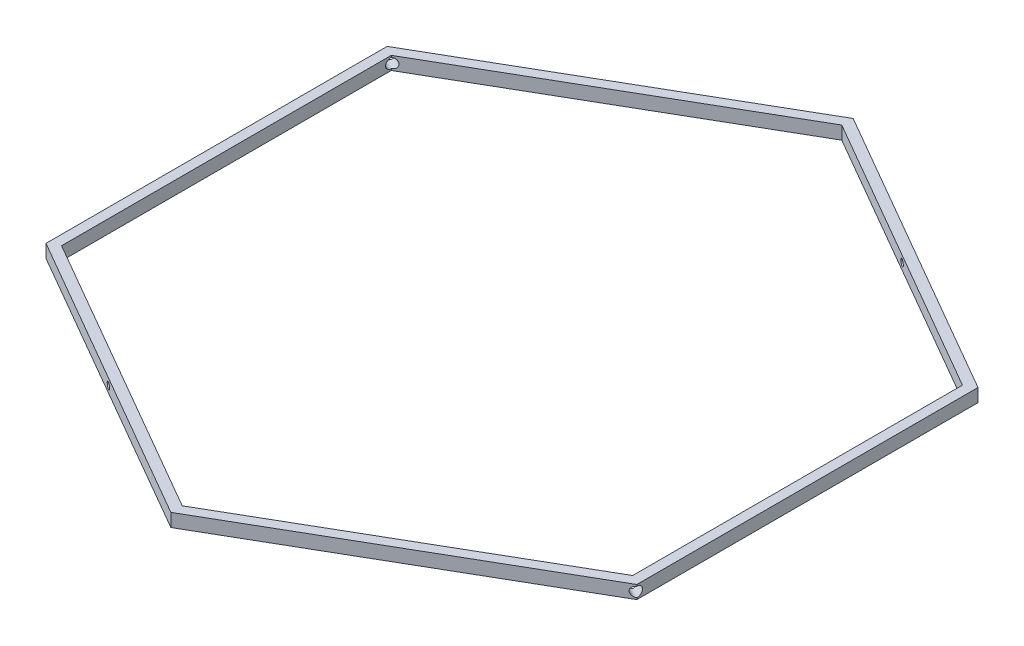
ISO-10303-21;
HEADER;
FILE_DESCRIPTION(('STEP AP214'),'2;1');
FILE_NAME('part.step','',(''),(''),'','','');
FILE_SCHEMA(('AUTOMOTIVE_DESIGN { 1 0 10303 214 1 1 1 1 }'));
ENDSEC;
DATA;
#1=APPLICATION_CONTEXT('core data for automotive mechanical design processes');
#2=APPLICATION_PROTOCOL_DEFINITION('international standard','automotive_design',2000,#1);
#3=PRODUCT_CONTEXT('',#1,'mechanical');
#4=PRODUCT('Part','Part','',(#3));
#5=PRODUCT_RELATED_PRODUCT_CATEGORY('part','',(#4));
#6=PRODUCT_DEFINITION_FORMATION('','',#4);
#7=PRODUCT_DEFINITION_CONTEXT('part definition',#1,'design');
#8=PRODUCT_DEFINITION('design','',#6,#7);
#9=PRODUCT_DEFINITION_SHAPE('','',#8);
#10=(LENGTH_UNIT() NAMED_UNIT(*) SI_UNIT(.MILLI.,.METRE.));
#11=(NAMED_UNIT(*) PLANE_ANGLE_UNIT() SI_UNIT($,.RADIAN.));
#12=(NAMED_UNIT(*) SI_UNIT($,.STERADIAN.) SOLID_ANGLE_UNIT());
#13=UNCERTAINTY_MEASURE_WITH_UNIT(LENGTH_MEASURE(1.E-05),#10,'distance_accuracy_value','');
#14=(GEOMETRIC_REPRESENTATION_CONTEXT(3) GLOBAL_UNCERTAINTY_ASSIGNED_CONTEXT((#13)) GLOBAL_UNIT_ASSIGNED_CONTEXT((#10,
#11,#12)) REPRESENTATION_CONTEXT('',''));
#15=CARTESIAN_POINT('',(0.,0.,0.));
#16=DIRECTION('',(0.,0.,1.));
#17=DIRECTION('',(1.,0.,0.));
#18=AXIS2_PLACEMENT_3D('',#15,#16,#17);
#19=CARTESIAN_POINT('',(0.,4.,0.));
#20=DIRECTION('',(0.,1.,0.));
#21=DIRECTION('',(0.,0.,1.));
#22=AXIS2_PLACEMENT_3D('',#19,#20,#21);
#23=PLANE('',#22);
#24=DIRECTION('',(-0.866025403784439,0.,-0.5));
#25=VECTOR('',#24,1.);
#26=CARTESIAN_POINT('',(90.,4.,-51.9615242270663));
#27=LINE('',#26,#25);
#28=CARTESIAN_POINT('',(90.,4.,-51.9615242270663));
#29=VERTEX_POINT('',#28);
#30=CARTESIAN_POINT('',(0.,4.,-103.923048454133));
#31=VERTEX_POINT('',#30);
#32=EDGE_CURVE('E200',#29,#31,#27,.T.);
#33=ORIENTED_EDGE('',*,*,#32,.T.);
#34=DIRECTION('',(-0.866025403784438,0.,0.5));
#35=VECTOR('',#34,1.);
#36=CARTESIAN_POINT('',(0.,4.,-103.923048454133));
#37=LINE('',#36,#35);
#38=CARTESIAN_POINT('',(-90.,4.,-51.9615242270663));
#39=VERTEX_POINT('',#38);
#40=EDGE_CURVE('E204',#31,#39,#37,.T.);
#41=ORIENTED_EDGE('',*,*,#40,.T.);
#42=DIRECTION('',(0.,0.,1.));
#43=VECTOR('',#42,1.);
#44=CARTESIAN_POINT('',(-90.,4.,-51.9615242270663));
#45=LINE('',#44,#43);
#46=CARTESIAN_POINT('',(-90.,4.,51.9615242270663));
#47=VERTEX_POINT('',#46);
#48=EDGE_CURVE('E208',#39,#47,#45,.T.);
#49=ORIENTED_EDGE('',*,*,#48,.T.);
#50=DIRECTION('',(0.866025403784439,0.,0.5));
#51=VECTOR('',#50,1.);
#52=CARTESIAN_POINT('',(-90.,4.,51.9615242270663));
#53=LINE('',#52,#51);
#54=CARTESIAN_POINT('',(0.,4.,103.923048454133));
#55=VERTEX_POINT('',#54);
#56=EDGE_CURVE('E211',#47,#55,#53,.T.);
#57=ORIENTED_EDGE('',*,*,#56,.T.);
#58=DIRECTION('',(0.866025403784438,0.,-0.5));
#59=VECTOR('',#58,1.);
#60=CARTESIAN_POINT('',(0.,4.,103.923048454133));
#61=LINE('',#60,#59);
#62=CARTESIAN_POINT('',(90.,4.,51.9615242270663));
#63=VERTEX_POINT('',#62);
#64=EDGE_CURVE('E214',#55,#63,#61,.T.);
#65=ORIENTED_EDGE('',*,*,#64,.T.);
#66=DIRECTION('',(0.,0.,-1.));
#67=VECTOR('',#66,1.);
#68=CARTESIAN_POINT('',(90.,4.,51.9615242270663));
#69=LINE('',#68,#67);
#70=EDGE_CURVE('E217',#63,#29,#69,.T.);
#71=ORIENTED_EDGE('',*,*,#70,.T.);
#72=EDGE_LOOP('',(#33,#41,#49,#57,#65,#71));
#73=FACE_BOUND('',#72,.T.);
#74=DIRECTION('',(-0.866025403784439,0.,-0.5));
#75=VECTOR('',#74,1.);
#76=CARTESIAN_POINT('',(87.,4.,-50.2294734194974));
#77=LINE('',#76,#75);
#78=CARTESIAN_POINT('',(87.,4.,-50.2294734194974));
#79=VERTEX_POINT('',#78);
#80=CARTESIAN_POINT('',(0.,4.,-100.458946838995));
#81=VERTEX_POINT('',#80);
#82=EDGE_CURVE('E291',#79,#81,#77,.T.);
#83=ORIENTED_EDGE('',*,*,#82,.F.);
#84=DIRECTION('',(0.,0.,-1.));
#85=VECTOR('',#84,1.);
#86=CARTESIAN_POINT('',(87.,4.,50.2294734194974));
#87=LINE('',#86,#85);
#88=CARTESIAN_POINT('',(87.,4.,50.2294734194974));
#89=VERTEX_POINT('',#88);
#90=EDGE_CURVE('E288',#89,#79,#87,.T.);
#91=ORIENTED_EDGE('',*,*,#90,.F.);
#92=DIRECTION('',(0.866025403784439,0.,-0.5));
#93=VECTOR('',#92,1.);
#94=CARTESIAN_POINT('',(0.,4.,100.458946838995));
#95=LINE('',#94,#93);
#96=CARTESIAN_POINT('',(0.,4.,100.458946838995));
#97=VERTEX_POINT('',#96);
#98=EDGE_CURVE('E173',#97,#89,#95,.T.);
#99=ORIENTED_EDGE('',*,*,#98,.F.);
#100=DIRECTION('',(0.866025403784439,0.,0.5));
#101=VECTOR('',#100,1.);
#102=CARTESIAN_POINT('',(-87.,4.,50.2294734194975));
#103=LINE('',#102,#101);
#104=CARTESIAN_POINT('',(-87.,4.,50.2294734194975));
#105=VERTEX_POINT('',#104);
#106=EDGE_CURVE('E300',#105,#97,#103,.T.);
#107=ORIENTED_EDGE('',*,*,#106,.F.);
#108=DIRECTION('',(0.,0.,1.));
#109=VECTOR('',#108,1.);
#110=CARTESIAN_POINT('',(-87.,4.,-50.2294734194974));
#111=LINE('',#110,#109);
#112=CARTESIAN_POINT('',(-87.,4.,-50.2294734194974));
#113=VERTEX_POINT('',#112);
#114=EDGE_CURVE('E297',#113,#105,#111,.T.);
#115=ORIENTED_EDGE('',*,*,#114,.F.);
#116=DIRECTION('',(-0.866025403784439,0.,0.5));
#117=VECTOR('',#116,1.);
#118=CARTESIAN_POINT('',(0.,4.,-100.458946838995));
#119=LINE('',#118,#117);
#120=EDGE_CURVE('E294',#81,#113,#119,.T.);
#121=ORIENTED_EDGE('',*,*,#120,.F.);
#122=EDGE_LOOP('',(#83,#91,#99,#107,#115,#121));
#123=FACE_BOUND('',#122,.T.);
#124=ADVANCED_FACE('F43',(#73,#123),#23,.T.);
#125=CARTESIAN_POINT('',(0.,0.,0.));
#126=DIRECTION('',(0.,1.,0.));
#127=DIRECTION('',(0.,0.,1.));
#128=AXIS2_PLACEMENT_3D('',#125,#126,#127);
#129=PLANE('',#128);
#130=DIRECTION('',(-0.866025403784439,0.,-0.5));
#131=VECTOR('',#130,1.);
#132=CARTESIAN_POINT('',(90.,0.,-51.9615242270663));
#133=LINE('',#132,#131);
#134=CARTESIAN_POINT('',(90.,0.,-51.9615242270663));
#135=VERTEX_POINT('',#134);
#136=CARTESIAN_POINT('',(0.,0.,-103.923048454133));
#137=VERTEX_POINT('',#136);
#138=EDGE_CURVE('E199',#135,#137,#133,.T.);
#139=ORIENTED_EDGE('',*,*,#138,.F.);
#140=DIRECTION('',(0.,0.,-1.));
#141=VECTOR('',#140,1.);
#142=CARTESIAN_POINT('',(90.,0.,51.9615242270663));
#143=LINE('',#142,#141);
#144=CARTESIAN_POINT('',(90.,0.,51.9615242270663));
#145=VERTEX_POINT('',#144);
#146=EDGE_CURVE('E205',#145,#135,#143,.T.);
#147=ORIENTED_EDGE('',*,*,#146,.F.);
#148=DIRECTION('',(0.866025403784438,0.,-0.5));
#149=VECTOR('',#148,1.);
#150=CARTESIAN_POINT('',(0.,0.,103.923048454133));
#151=LINE('',#150,#149);
#152=CARTESIAN_POINT('',(0.,0.,103.923048454133));
#153=VERTEX_POINT('',#152);
#154=EDGE_CURVE('E234',#153,#145,#151,.T.);
#155=ORIENTED_EDGE('',*,*,#154,.F.);
#156=DIRECTION('',(0.866025403784439,0.,0.5));
#157=VECTOR('',#156,1.);
#158=CARTESIAN_POINT('',(-90.,0.,51.9615242270663));
#159=LINE('',#158,#157);
#160=CARTESIAN_POINT('',(-90.,0.,51.9615242270663));
#161=VERTEX_POINT('',#160);
#162=EDGE_CURVE('E231',#161,#153,#159,.T.);
#163=ORIENTED_EDGE('',*,*,#162,.F.);
#164=DIRECTION('',(0.,0.,1.));
#165=VECTOR('',#164,1.);
#166=CARTESIAN_POINT('',(-90.,0.,-51.9615242270663));
#167=LINE('',#166,#165);
#168=CARTESIAN_POINT('',(-90.,0.,-51.9615242270663));
#169=VERTEX_POINT('',#168);
#170=EDGE_CURVE('E228',#169,#161,#167,.T.);
#171=ORIENTED_EDGE('',*,*,#170,.F.);
#172=DIRECTION('',(-0.866025403784438,0.,0.5));
#173=VECTOR('',#172,1.);
#174=CARTESIAN_POINT('',(0.,0.,-103.923048454133));
#175=LINE('',#174,#173);
#176=EDGE_CURVE('E224',#137,#169,#175,.T.);
#177=ORIENTED_EDGE('',*,*,#176,.F.);
#178=EDGE_LOOP('',(#139,#147,#155,#163,#171,#177));
#179=FACE_BOUND('',#178,.T.);
#180=DIRECTION('',(0.,0.,-1.));
#181=VECTOR('',#180,1.);
#182=CARTESIAN_POINT('',(87.,0.,50.2294734194974));
#183=LINE('',#182,#181);
#184=CARTESIAN_POINT('',(87.,0.,50.2294734194974));
#185=VERTEX_POINT('',#184);
#186=CARTESIAN_POINT('',(87.,0.,-50.2294734194974));
#187=VERTEX_POINT('',#186);
#188=EDGE_CURVE('E287',#185,#187,#183,.T.);
#189=ORIENTED_EDGE('',*,*,#188,.T.);
#190=DIRECTION('',(-0.866025403784439,0.,-0.5));
#191=VECTOR('',#190,1.);
#192=CARTESIAN_POINT('',(87.,0.,-50.2294734194974));
#193=LINE('',#192,#191);
#194=CARTESIAN_POINT('',(0.,0.,-100.458946838995));
#195=VERTEX_POINT('',#194);
#196=EDGE_CURVE('E309',#187,#195,#193,.T.);
#197=ORIENTED_EDGE('',*,*,#196,.T.);
#198=DIRECTION('',(-0.866025403784439,0.,0.5));
#199=VECTOR('',#198,1.);
#200=CARTESIAN_POINT('',(0.,0.,-100.458946838995));
#201=LINE('',#200,#199);
#202=CARTESIAN_POINT('',(-87.,0.,-50.2294734194974));
#203=VERTEX_POINT('',#202);
#204=EDGE_CURVE('E313',#195,#203,#201,.T.);
#205=ORIENTED_EDGE('',*,*,#204,.T.);
#206=DIRECTION('',(0.,0.,1.));
#207=VECTOR('',#206,1.);
#208=CARTESIAN_POINT('',(-87.,0.,-50.2294734194974));
#209=LINE('',#208,#207);
#210=CARTESIAN_POINT('',(-87.,0.,50.2294734194975));
#211=VERTEX_POINT('',#210);
#212=EDGE_CURVE('E317',#203,#211,#209,.T.);
#213=ORIENTED_EDGE('',*,*,#212,.T.);
#214=DIRECTION('',(0.866025403784439,0.,0.5));
#215=VECTOR('',#214,1.);
#216=CARTESIAN_POINT('',(-87.,0.,50.2294734194975));
#217=LINE('',#216,#215);
#218=CARTESIAN_POINT('',(0.,0.,100.458946838995));
#219=VERTEX_POINT('',#218);
#220=EDGE_CURVE('E320',#211,#219,#217,.T.);
#221=ORIENTED_EDGE('',*,*,#220,.T.);
#222=DIRECTION('',(0.866025403784439,0.,-0.5));
#223=VECTOR('',#222,1.);
#224=CARTESIAN_POINT('',(0.,0.,100.458946838995));
#225=LINE('',#224,#223);
#226=EDGE_CURVE('E182',#219,#185,#225,.T.);
#227=ORIENTED_EDGE('',*,*,#226,.T.);
#228=EDGE_LOOP('',(#189,#197,#205,#213,#221,#227));
#229=FACE_BOUND('',#228,.T.);
#230=ADVANCED_FACE('F328',(#179,#229),#129,.F.);
#231=CARTESIAN_POINT('',(90.,4.,-51.9615242270663));
#232=DIRECTION('',(-0.5,0.,0.866025403784438));
#233=DIRECTION('',(0.866025403784439,0.,0.5));
#234=AXIS2_PLACEMENT_3D('',#231,#232,#233);
#235=PLANE('',#234);
#236=CARTESIAN_POINT('',(45.,2.,-77.9422863405995));
#237=DIRECTION('',(-0.5,0.,0.866025403784438));
#238=DIRECTION('',(0.866025403784439,0.,0.5));
#239=AXIS2_PLACEMENT_3D('',#236,#237,#238);
#240=CIRCLE('',#239,0.999999999999999);
#241=CARTESIAN_POINT('',(45.8660254037845,2.,-77.4422863405995));
#242=VERTEX_POINT('',#241);
#243=EDGE_CURVE('E273',#242,#242,#240,.T.);
#244=ORIENTED_EDGE('',*,*,#243,.T.);
#245=EDGE_LOOP('',(#244));
#246=FACE_BOUND('',#245,.T.);
#247=ORIENTED_EDGE('',*,*,#138,.T.);
#248=DIRECTION('',(0.,-1.,0.));
#249=VECTOR('',#248,1.);
#250=CARTESIAN_POINT('',(0.,4.,-103.923048454133));
#251=LINE('',#250,#249);
#252=EDGE_CURVE('E52',#31,#137,#251,.T.);
#253=ORIENTED_EDGE('',*,*,#252,.F.);
#254=ORIENTED_EDGE('',*,*,#32,.F.);
#255=DIRECTION('',(0.,-1.,0.));
#256=VECTOR('',#255,1.);
#257=CARTESIAN_POINT('',(90.,4.,-51.9615242270663));
#258=LINE('',#257,#256);
#259=EDGE_CURVE('E220',#29,#135,#258,.T.);
#260=ORIENTED_EDGE('',*,*,#259,.T.);
#261=EDGE_LOOP('',(#247,#253,#254,#260));
#262=FACE_BOUND('',#261,.T.);
#263=ADVANCED_FACE('F45',(#246,#262),#235,.F.);
#264=CARTESIAN_POINT('',(0.,4.,-103.923048454133));
#265=DIRECTION('',(0.5,0.,0.866025403784438));
#266=DIRECTION('',(0.866025403784439,0.,-0.5));
#267=AXIS2_PLACEMENT_3D('',#264,#265,#266);
#268=PLANE('',#267);
#269=DIRECTION('',(0.,-1.,0.));
#270=VECTOR('',#269,1.);
#271=CARTESIAN_POINT('',(-90.,4.,-51.9615242270663));
#272=LINE('',#271,#270);
#273=CARTESIAN_POINT('',(-90.,0.500000000000002,-51.9615242270663));
#274=VERTEX_POINT('',#273);
#275=EDGE_CURVE('E256',#274,#169,#272,.T.);
#276=ORIENTED_EDGE('',*,*,#275,.F.);
#277=CARTESIAN_POINT('',(-90.,2.,-51.9615242270663));
#278=DIRECTION('',(0.5,0.,0.866025403784438));
#279=DIRECTION('',(-0.866025403784439,0.,0.5));
#280=AXIS2_PLACEMENT_3D('',#277,#278,#279);
#281=ELLIPSE('',#280,1.73205080756887,1.5);
#282=CARTESIAN_POINT('',(-90.,3.5,-51.9615242270663));
#283=VERTEX_POINT('',#282);
#284=EDGE_CURVE('E58',#274,#283,#281,.T.);
#285=ORIENTED_EDGE('',*,*,#284,.T.);
#286=EDGE_CURVE('E257',#39,#283,#272,.T.);
#287=ORIENTED_EDGE('',*,*,#286,.F.);
#288=ORIENTED_EDGE('',*,*,#40,.F.);
#289=ORIENTED_EDGE('',*,*,#252,.T.);
#290=ORIENTED_EDGE('',*,*,#176,.T.);
#291=EDGE_LOOP('',(#276,#285,#287,#288,#289,#290));
#292=FACE_BOUND('',#291,.T.);
#293=ADVANCED_FACE('F367',(#292),#268,.F.);
#294=CARTESIAN_POINT('',(-90.,4.,-51.9615242270663));
#295=DIRECTION('',(1.,0.,0.));
#296=DIRECTION('',(0.,0.,-1.));
#297=AXIS2_PLACEMENT_3D('',#294,#295,#296);
#298=PLANE('',#297);
#299=ORIENTED_EDGE('',*,*,#286,.T.);
#300=CARTESIAN_POINT('',(-90.,2.,-51.9615242270663));
#301=DIRECTION('',(1.,0.,0.));
#302=DIRECTION('',(0.,0.,-1.));
#303=AXIS2_PLACEMENT_3D('',#300,#301,#302);
#304=ELLIPSE('',#303,1.73205080756887,1.5);
#305=EDGE_CURVE('E280',#283,#274,#304,.T.);
#306=ORIENTED_EDGE('',*,*,#305,.T.);
#307=ORIENTED_EDGE('',*,*,#275,.T.);
#308=ORIENTED_EDGE('',*,*,#170,.T.);
#309=DIRECTION('',(0.,-1.,0.));
#310=VECTOR('',#309,1.);
#311=CARTESIAN_POINT('',(-90.,4.,51.9615242270663));
#312=LINE('',#311,#310);
#313=EDGE_CURVE('E252',#47,#161,#312,.T.);
#314=ORIENTED_EDGE('',*,*,#313,.F.);
#315=ORIENTED_EDGE('',*,*,#48,.F.);
#316=EDGE_LOOP('',(#299,#306,#307,#308,#314,#315));
#317=FACE_BOUND('',#316,.T.);
#318=ADVANCED_FACE('F363',(#317),#298,.F.);
#319=CARTESIAN_POINT('',(-90.,4.,51.9615242270663));
#320=DIRECTION('',(0.5,0.,-0.866025403784439));
#321=DIRECTION('',(-0.866025403784439,0.,-0.5));
#322=AXIS2_PLACEMENT_3D('',#319,#320,#321);
#323=PLANE('',#322);
#324=CARTESIAN_POINT('',(-45.,2.,77.9422863405996));
#325=DIRECTION('',(-0.5,0.,0.866025403784439));
#326=DIRECTION('',(0.866025403784439,0.,0.5));
#327=AXIS2_PLACEMENT_3D('',#324,#325,#326);
#328=CIRCLE('',#327,0.999999999999999);
#329=CARTESIAN_POINT('',(-44.1339745962156,2.,78.4422863405996));
#330=VERTEX_POINT('',#329);
#331=EDGE_CURVE('E267',#330,#330,#328,.T.);
#332=ORIENTED_EDGE('',*,*,#331,.F.);
#333=EDGE_LOOP('',(#332));
#334=FACE_BOUND('',#333,.T.);
#335=ORIENTED_EDGE('',*,*,#162,.T.);
#336=DIRECTION('',(0.,-1.,0.));
#337=VECTOR('',#336,1.);
#338=CARTESIAN_POINT('',(0.,4.,103.923048454133));
#339=LINE('',#338,#337);
#340=EDGE_CURVE('E248',#55,#153,#339,.T.);
#341=ORIENTED_EDGE('',*,*,#340,.F.);
#342=ORIENTED_EDGE('',*,*,#56,.F.);
#343=ORIENTED_EDGE('',*,*,#313,.T.);
#344=EDGE_LOOP('',(#335,#341,#342,#343));
#345=FACE_BOUND('',#344,.T.);
#346=ADVANCED_FACE('F402',(#334,#345),#323,.F.);
#347=CARTESIAN_POINT('',(0.,4.,103.923048454133));
#348=DIRECTION('',(-0.5,0.,-0.866025403784438));
#349=DIRECTION('',(-0.866025403784439,0.,0.5));
#350=AXIS2_PLACEMENT_3D('',#347,#348,#349);
#351=PLANE('',#350);
#352=DIRECTION('',(0.,-1.,0.));
#353=VECTOR('',#352,1.);
#354=CARTESIAN_POINT('',(90.,4.,51.9615242270663));
#355=LINE('',#354,#353);
#356=CARTESIAN_POINT('',(90.,0.500000000000002,51.9615242270663));
#357=VERTEX_POINT('',#356);
#358=EDGE_CURVE('E243',#357,#145,#355,.T.);
#359=ORIENTED_EDGE('',*,*,#358,.F.);
#360=CARTESIAN_POINT('',(90.,2.,51.9615242270663));
#361=DIRECTION('',(-0.5,0.,-0.866025403784438));
#362=DIRECTION('',(-0.866025403784439,0.,0.5));
#363=AXIS2_PLACEMENT_3D('',#360,#361,#362);
#364=ELLIPSE('',#363,1.73205080756887,1.5);
#365=CARTESIAN_POINT('',(90.,3.5,51.9615242270663));
#366=VERTEX_POINT('',#365);
#367=EDGE_CURVE('E65',#357,#366,#364,.T.);
#368=ORIENTED_EDGE('',*,*,#367,.T.);
#369=EDGE_CURVE('E244',#63,#366,#355,.T.);
#370=ORIENTED_EDGE('',*,*,#369,.F.);
#371=ORIENTED_EDGE('',*,*,#64,.F.);
#372=ORIENTED_EDGE('',*,*,#340,.T.);
#373=ORIENTED_EDGE('',*,*,#154,.T.);
#374=EDGE_LOOP('',(#359,#368,#370,#371,#372,#373));
#375=FACE_BOUND('',#374,.T.);
#376=ADVANCED_FACE('F398',(#375),#351,.F.);
#377=CARTESIAN_POINT('',(90.,4.,51.9615242270663));
#378=DIRECTION('',(-1.,0.,0.));
#379=DIRECTION('',(0.,0.,1.));
#380=AXIS2_PLACEMENT_3D('',#377,#378,#379);
#381=PLANE('',#380);
#382=ORIENTED_EDGE('',*,*,#369,.T.);
#383=CARTESIAN_POINT('',(90.,2.,51.9615242270663));
#384=DIRECTION('',(-1.,0.,0.));
#385=DIRECTION('',(0.,0.,-1.));
#386=AXIS2_PLACEMENT_3D('',#383,#384,#385);
#387=ELLIPSE('',#386,1.73205080756888,1.5);
#388=EDGE_CURVE('E354',#366,#357,#387,.T.);
#389=ORIENTED_EDGE('',*,*,#388,.T.);
#390=ORIENTED_EDGE('',*,*,#358,.T.);
#391=ORIENTED_EDGE('',*,*,#146,.T.);
#392=ORIENTED_EDGE('',*,*,#259,.F.);
#393=ORIENTED_EDGE('',*,*,#70,.F.);
#394=EDGE_LOOP('',(#382,#389,#390,#391,#392,#393));
#395=FACE_BOUND('',#394,.T.);
#396=ADVANCED_FACE('F395',(#395),#381,.F.);
#397=CARTESIAN_POINT('',(87.,4.,50.2294734194974));
#398=DIRECTION('',(-1.,0.,0.));
#399=DIRECTION('',(0.,0.,1.));
#400=AXIS2_PLACEMENT_3D('',#397,#398,#399);
#401=PLANE('',#400);
#402=CARTESIAN_POINT('',(87.,2.,50.2294734194975));
#403=DIRECTION('',(-1.,0.,0.));
#404=DIRECTION('',(0.,0.,-1.));
#405=AXIS2_PLACEMENT_3D('',#402,#403,#404);
#406=ELLIPSE('',#405,1.73205080756887,1.5);
#407=CARTESIAN_POINT('',(87.,3.5,50.2294734194974));
#408=VERTEX_POINT('',#407);
#409=CARTESIAN_POINT('',(87.,0.500000000000002,50.2294734194974));
#410=VERTEX_POINT('',#409);
#411=EDGE_CURVE('E157',#408,#410,#406,.T.);
#412=ORIENTED_EDGE('',*,*,#411,.F.);
#413=DIRECTION('',(0.,-1.,0.));
#414=VECTOR('',#413,1.);
#415=CARTESIAN_POINT('',(87.,4.,50.2294734194974));
#416=LINE('',#415,#414);
#417=EDGE_CURVE('E164',#89,#408,#416,.T.);
#418=ORIENTED_EDGE('',*,*,#417,.F.);
#419=ORIENTED_EDGE('',*,*,#90,.T.);
#420=DIRECTION('',(0.,-1.,0.));
#421=VECTOR('',#420,1.);
#422=CARTESIAN_POINT('',(87.,4.,-50.2294734194974));
#423=LINE('',#422,#421);
#424=EDGE_CURVE('E195',#79,#187,#423,.T.);
#425=ORIENTED_EDGE('',*,*,#424,.T.);
#426=ORIENTED_EDGE('',*,*,#188,.F.);
#427=EDGE_CURVE('E167',#410,#185,#416,.T.);
#428=ORIENTED_EDGE('',*,*,#427,.F.);
#429=EDGE_LOOP('',(#412,#418,#419,#425,#426,#428));
#430=FACE_BOUND('',#429,.T.);
#431=ADVANCED_FACE('F163',(#430),#401,.T.);
#432=CARTESIAN_POINT('',(87.,4.,-50.2294734194974));
#433=DIRECTION('',(-0.5,0.,0.866025403784439));
#434=DIRECTION('',(0.866025403784439,0.,0.5));
#435=AXIS2_PLACEMENT_3D('',#432,#433,#434);
#436=PLANE('',#435);
#437=CARTESIAN_POINT('',(43.5,2.,-75.3442101292462));
#438=DIRECTION('',(-0.5,0.,0.866025403784439));
#439=DIRECTION('',(0.866025403784439,0.,0.5));
#440=AXIS2_PLACEMENT_3D('',#437,#438,#439);
#441=CIRCLE('',#440,0.999999999999999);
#442=CARTESIAN_POINT('',(44.3660254037845,2.,-74.8442101292462));
#443=VERTEX_POINT('',#442);
#444=EDGE_CURVE('E266',#443,#443,#441,.T.);
#445=ORIENTED_EDGE('',*,*,#444,.F.);
#446=EDGE_LOOP('',(#445));
#447=FACE_BOUND('',#446,.T.);
#448=ORIENTED_EDGE('',*,*,#196,.F.);
#449=ORIENTED_EDGE('',*,*,#424,.F.);
#450=ORIENTED_EDGE('',*,*,#82,.T.);
#451=DIRECTION('',(0.,-1.,0.));
#452=VECTOR('',#451,1.);
#453=CARTESIAN_POINT('',(0.,4.,-100.458946838995));
#454=LINE('',#453,#452);
#455=EDGE_CURVE('E192',#81,#195,#454,.T.);
#456=ORIENTED_EDGE('',*,*,#455,.T.);
#457=EDGE_LOOP('',(#448,#449,#450,#456));
#458=FACE_BOUND('',#457,.T.);
#459=ADVANCED_FACE('F332',(#447,#458),#436,.T.);
#460=CARTESIAN_POINT('',(0.,4.,-100.458946838995));
#461=DIRECTION('',(0.5,0.,0.866025403784439));
#462=DIRECTION('',(0.866025403784439,0.,-0.5));
#463=AXIS2_PLACEMENT_3D('',#460,#461,#462);
#464=PLANE('',#463);
#465=CARTESIAN_POINT('',(-87.,2.,-50.2294734194974));
#466=DIRECTION('',(0.5,0.,0.866025403784439));
#467=DIRECTION('',(-0.866025403784439,0.,0.5));
#468=AXIS2_PLACEMENT_3D('',#465,#466,#467);
#469=ELLIPSE('',#468,1.73205080756887,1.5);
#470=CARTESIAN_POINT('',(-87.,0.500000000000002,-50.2294734194974));
#471=VERTEX_POINT('',#470);
#472=CARTESIAN_POINT('',(-87.,3.5,-50.2294734194974));
#473=VERTEX_POINT('',#472);
#474=EDGE_CURVE('E351',#471,#473,#469,.T.);
#475=ORIENTED_EDGE('',*,*,#474,.F.);
#476=DIRECTION('',(0.,-1.,0.));
#477=VECTOR('',#476,1.);
#478=CARTESIAN_POINT('',(-87.,4.,-50.2294734194974));
#479=LINE('',#478,#477);
#480=EDGE_CURVE('E187',#471,#203,#479,.T.);
#481=ORIENTED_EDGE('',*,*,#480,.T.);
#482=ORIENTED_EDGE('',*,*,#204,.F.);
#483=ORIENTED_EDGE('',*,*,#455,.F.);
#484=ORIENTED_EDGE('',*,*,#120,.T.);
#485=EDGE_CURVE('E188',#113,#473,#479,.T.);
#486=ORIENTED_EDGE('',*,*,#485,.T.);
#487=EDGE_LOOP('',(#475,#481,#482,#483,#484,#486));
#488=FACE_BOUND('',#487,.T.);
#489=ADVANCED_FACE('F341',(#488),#464,.T.);
#490=CARTESIAN_POINT('',(-87.,4.,-50.2294734194974));
#491=DIRECTION('',(1.,0.,0.));
#492=DIRECTION('',(0.,0.,-1.));
#493=AXIS2_PLACEMENT_3D('',#490,#491,#492);
#494=PLANE('',#493);
#495=CARTESIAN_POINT('',(-87.,2.,-50.2294734194974));
#496=DIRECTION('',(1.,0.,0.));
#497=DIRECTION('',(0.,0.,-1.));
#498=AXIS2_PLACEMENT_3D('',#495,#496,#497);
#499=ELLIPSE('',#498,1.73205080756887,1.5);
#500=EDGE_CURVE('E169',#473,#471,#499,.T.);
#501=ORIENTED_EDGE('',*,*,#500,.F.);
#502=ORIENTED_EDGE('',*,*,#485,.F.);
#503=ORIENTED_EDGE('',*,*,#114,.T.);
#504=DIRECTION('',(0.,-1.,0.));
#505=VECTOR('',#504,1.);
#506=CARTESIAN_POINT('',(-87.,4.,50.2294734194975));
#507=LINE('',#506,#505);
#508=EDGE_CURVE('E179',#105,#211,#507,.T.);
#509=ORIENTED_EDGE('',*,*,#508,.T.);
#510=ORIENTED_EDGE('',*,*,#212,.F.);
#511=ORIENTED_EDGE('',*,*,#480,.F.);
#512=EDGE_LOOP('',(#501,#502,#503,#509,#510,#511));
#513=FACE_BOUND('',#512,.T.);
#514=ADVANCED_FACE('F345',(#513),#494,.T.);
#515=CARTESIAN_POINT('',(-87.,4.,50.2294734194975));
#516=DIRECTION('',(0.5,0.,-0.866025403784439));
#517=DIRECTION('',(-0.866025403784439,0.,-0.5));
#518=AXIS2_PLACEMENT_3D('',#515,#516,#517);
#519=PLANE('',#518);
#520=CARTESIAN_POINT('',(-43.4999999999999,2.,75.3442101292462));
#521=DIRECTION('',(0.5,0.,-0.866025403784439));
#522=DIRECTION('',(-0.866025403784439,0.,-0.5));
#523=AXIS2_PLACEMENT_3D('',#520,#521,#522);
#524=CIRCLE('',#523,0.999999999999999);
#525=CARTESIAN_POINT('',(-44.3660254037844,2.,74.8442101292462));
#526=VERTEX_POINT('',#525);
#527=EDGE_CURVE('E263',#526,#526,#524,.T.);
#528=ORIENTED_EDGE('',*,*,#527,.F.);
#529=EDGE_LOOP('',(#528));
#530=FACE_BOUND('',#529,.T.);
#531=ORIENTED_EDGE('',*,*,#220,.F.);
#532=ORIENTED_EDGE('',*,*,#508,.F.);
#533=ORIENTED_EDGE('',*,*,#106,.T.);
#534=DIRECTION('',(0.,-1.,0.));
#535=VECTOR('',#534,1.);
#536=CARTESIAN_POINT('',(0.,4.,100.458946838995));
#537=LINE('',#536,#535);
#538=EDGE_CURVE('E175',#97,#219,#537,.T.);
#539=ORIENTED_EDGE('',*,*,#538,.T.);
#540=EDGE_LOOP('',(#531,#532,#533,#539));
#541=FACE_BOUND('',#540,.T.);
#542=ADVANCED_FACE('F373',(#530,#541),#519,.T.);
#543=CARTESIAN_POINT('',(0.,4.,100.458946838995));
#544=DIRECTION('',(-0.5,0.,-0.866025403784439));
#545=DIRECTION('',(-0.866025403784439,0.,0.5));
#546=AXIS2_PLACEMENT_3D('',#543,#544,#545);
#547=PLANE('',#546);
#548=CARTESIAN_POINT('',(87.,2.,50.2294734194974));
#549=DIRECTION('',(-0.5,0.,-0.866025403784439));
#550=DIRECTION('',(-0.866025403784439,0.,0.5));
#551=AXIS2_PLACEMENT_3D('',#548,#549,#550);
#552=ELLIPSE('',#551,1.73205080756887,1.5);
#553=EDGE_CURVE('E11',#410,#408,#552,.T.);
#554=ORIENTED_EDGE('',*,*,#553,.F.);
#555=ORIENTED_EDGE('',*,*,#427,.T.);
#556=ORIENTED_EDGE('',*,*,#226,.F.);
#557=ORIENTED_EDGE('',*,*,#538,.F.);
#558=ORIENTED_EDGE('',*,*,#98,.T.);
#559=ORIENTED_EDGE('',*,*,#417,.T.);
#560=EDGE_LOOP('',(#554,#555,#556,#557,#558,#559));
#561=FACE_BOUND('',#560,.T.);
#562=ADVANCED_FACE('F171',(#561),#547,.T.);
#563=CARTESIAN_POINT('',(67.5,2.,-116.913429510899));
#564=DIRECTION('',(-0.5,0.,0.866025403784439));
#565=DIRECTION('',(0.866025403784439,0.,0.5));
#566=AXIS2_PLACEMENT_3D('',#563,#564,#565);
#567=CYLINDRICAL_SURFACE('',#566,0.999999999999999);
#568=ORIENTED_EDGE('',*,*,#527,.T.);
#569=EDGE_LOOP('',(#568));
#570=FACE_BOUND('',#569,.T.);
#571=ORIENTED_EDGE('',*,*,#331,.T.);
#572=EDGE_LOOP('',(#571));
#573=FACE_BOUND('',#572,.T.);
#574=ADVANCED_FACE('F381',(#570,#573),#567,.F.);
#575=ORIENTED_EDGE('',*,*,#444,.T.);
#576=EDGE_LOOP('',(#575));
#577=FACE_BOUND('',#576,.T.);
#578=ORIENTED_EDGE('',*,*,#243,.F.);
#579=EDGE_LOOP('',(#578));
#580=FACE_BOUND('',#579,.T.);
#581=ADVANCED_FACE('F434',(#577,#580),#567,.F.);
#582=CARTESIAN_POINT('',(112.5,2.,64.9519052838329));
#583=DIRECTION('',(-0.866025403784439,0.,-0.5));
#584=DIRECTION('',(-0.5,0.,0.866025403784439));
#585=AXIS2_PLACEMENT_3D('',#582,#583,#584);
#586=CYLINDRICAL_SURFACE('',#585,1.5);
#587=ORIENTED_EDGE('',*,*,#411,.T.);
#588=ORIENTED_EDGE('',*,*,#553,.T.);
#589=EDGE_LOOP('',(#587,#588));
#590=FACE_BOUND('',#589,.T.);
#591=ORIENTED_EDGE('',*,*,#388,.F.);
#592=ORIENTED_EDGE('',*,*,#367,.F.);
#593=EDGE_LOOP('',(#591,#592));
#594=FACE_BOUND('',#593,.T.);
#595=ADVANCED_FACE('F156',(#590,#594),#586,.F.);
#596=ORIENTED_EDGE('',*,*,#474,.T.);
#597=ORIENTED_EDGE('',*,*,#500,.T.);
#598=EDGE_LOOP('',(#596,#597));
#599=FACE_BOUND('',#598,.T.);
#600=ORIENTED_EDGE('',*,*,#305,.F.);
#601=ORIENTED_EDGE('',*,*,#284,.F.);
#602=EDGE_LOOP('',(#600,#601));
#603=FACE_BOUND('',#602,.T.);
#604=ADVANCED_FACE('F433',(#599,#603),#586,.F.);
#605=CLOSED_SHELL('',(#124,#230,#263,#293,#318,#346,#376,#396,#431,#459,#489,#514,#542,#562,
#574,#581,#595,#604));
#606=MANIFOLD_SOLID_BREP('B2',#605);
#607=ADVANCED_BREP_SHAPE_REPRESENTATION('',(#18,#606),#14);
#608=SHAPE_DEFINITION_REPRESENTATION(#9,#607);
ENDSEC;
END-ISO-10303-21;
